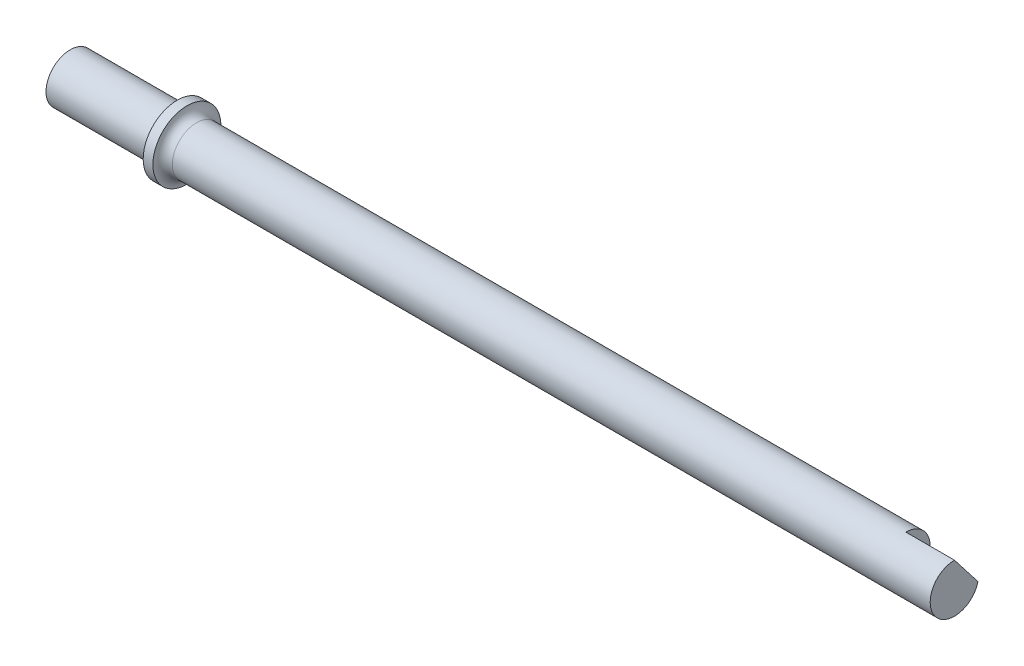
ISO-10303-21;
HEADER;
FILE_DESCRIPTION(('STEP AP214'),'2;1');
FILE_NAME('part.step','',(''),(''),'','','');
FILE_SCHEMA(('AUTOMOTIVE_DESIGN { 1 0 10303 214 1 1 1 1 }'));
ENDSEC;
DATA;
#1=APPLICATION_CONTEXT('core data for automotive mechanical design processes');
#2=APPLICATION_PROTOCOL_DEFINITION('international standard','automotive_design',2000,#1);
#3=PRODUCT_CONTEXT('',#1,'mechanical');
#4=PRODUCT('Part','Part','',(#3));
#5=PRODUCT_RELATED_PRODUCT_CATEGORY('part','',(#4));
#6=PRODUCT_DEFINITION_FORMATION('','',#4);
#7=PRODUCT_DEFINITION_CONTEXT('part definition',#1,'design');
#8=PRODUCT_DEFINITION('design','',#6,#7);
#9=PRODUCT_DEFINITION_SHAPE('','',#8);
#10=(LENGTH_UNIT() NAMED_UNIT(*) SI_UNIT(.MILLI.,.METRE.));
#11=(NAMED_UNIT(*) PLANE_ANGLE_UNIT() SI_UNIT($,.RADIAN.));
#12=(NAMED_UNIT(*) SI_UNIT($,.STERADIAN.) SOLID_ANGLE_UNIT());
#13=UNCERTAINTY_MEASURE_WITH_UNIT(LENGTH_MEASURE(1.E-05),#10,'distance_accuracy_value','');
#14=(GEOMETRIC_REPRESENTATION_CONTEXT(3) GLOBAL_UNCERTAINTY_ASSIGNED_CONTEXT((#13)) GLOBAL_UNIT_ASSIGNED_CONTEXT((#10,
#11,#12)) REPRESENTATION_CONTEXT('',''));
#15=CARTESIAN_POINT('',(0.,0.,0.));
#16=DIRECTION('',(0.,0.,1.));
#17=DIRECTION('',(1.,0.,0.));
#18=AXIS2_PLACEMENT_3D('',#15,#16,#17);
#19=CARTESIAN_POINT('',(-22.3967514323773,0.,0.));
#20=DIRECTION('',(-1.,0.,0.));
#21=DIRECTION('',(0.,0.,1.));
#22=AXIS2_PLACEMENT_3D('',#19,#20,#21);
#23=CYLINDRICAL_SURFACE('',#22,5.);
#24=CARTESIAN_POINT('',(26.,0.,0.));
#25=DIRECTION('',(-1.,0.,0.));
#26=DIRECTION('',(0.,0.,1.));
#27=AXIS2_PLACEMENT_3D('',#24,#25,#26);
#28=CIRCLE('',#27,5.);
#29=CARTESIAN_POINT('',(26.,0.,5.));
#30=VERTEX_POINT('',#29);
#31=EDGE_CURVE('E60',#30,#30,#28,.F.);
#32=ORIENTED_EDGE('',*,*,#31,.T.);
#33=EDGE_LOOP('',(#32));
#34=FACE_BOUND('',#33,.T.);
#35=CARTESIAN_POINT('',(182.,0.,0.));
#36=DIRECTION('',(-1.,0.,0.));
#37=DIRECTION('',(0.,0.,1.));
#38=AXIS2_PLACEMENT_3D('',#35,#36,#37);
#39=CIRCLE('',#38,5.);
#40=CARTESIAN_POINT('',(182.,-1.24224589981962,-4.84322466177044));
#41=VERTEX_POINT('',#40);
#42=CARTESIAN_POINT('',(182.,5.,0.));
#43=VERTEX_POINT('',#42);
#44=EDGE_CURVE('E91',#41,#43,#39,.T.);
#45=ORIENTED_EDGE('',*,*,#44,.T.);
#46=DIRECTION('',(-1.,0.,0.));
#47=VECTOR('',#46,1.);
#48=CARTESIAN_POINT('',(608.342194535885,5.,0.));
#49=LINE('',#48,#47);
#50=CARTESIAN_POINT('',(172.,5.,0.));
#51=VERTEX_POINT('',#50);
#52=EDGE_CURVE('E72',#43,#51,#49,.T.);
#53=ORIENTED_EDGE('',*,*,#52,.T.);
#54=CARTESIAN_POINT('',(172.,0.,0.));
#55=DIRECTION('',(-1.,0.,0.));
#56=DIRECTION('',(0.,0.,1.));
#57=AXIS2_PLACEMENT_3D('',#54,#55,#56);
#58=CIRCLE('',#57,5.);
#59=CARTESIAN_POINT('',(172.,-1.24224589981961,-4.84322466177044));
#60=VERTEX_POINT('',#59);
#61=EDGE_CURVE('E80',#51,#60,#58,.T.);
#62=ORIENTED_EDGE('',*,*,#61,.T.);
#63=DIRECTION('',(-1.,0.,0.));
#64=VECTOR('',#63,1.);
#65=CARTESIAN_POINT('',(608.342194535885,-1.24224589981962,-4.84322466177044));
#66=LINE('',#65,#64);
#67=EDGE_CURVE('E67',#41,#60,#66,.T.);
#68=ORIENTED_EDGE('',*,*,#67,.F.);
#69=EDGE_LOOP('',(#45,#53,#62,#68));
#70=FACE_BOUND('',#69,.T.);
#71=ADVANCED_FACE('F45',(#34,#70),#23,.T.);
#72=CARTESIAN_POINT('',(-22.3967514323773,0.,0.));
#73=DIRECTION('',(-1.,0.,0.));
#74=DIRECTION('',(0.,0.,1.));
#75=AXIS2_PLACEMENT_3D('',#72,#73,#74);
#76=CYLINDRICAL_SURFACE('',#75,7.);
#77=CARTESIAN_POINT('',(24.,0.,0.));
#78=DIRECTION('',(-1.,0.,0.));
#79=DIRECTION('',(0.,0.,1.));
#80=AXIS2_PLACEMENT_3D('',#77,#78,#79);
#81=CIRCLE('',#80,7.);
#82=CARTESIAN_POINT('',(24.,0.,7.));
#83=VERTEX_POINT('',#82);
#84=EDGE_CURVE('E116',#83,#83,#81,.T.);
#85=ORIENTED_EDGE('',*,*,#84,.T.);
#86=EDGE_LOOP('',(#85));
#87=FACE_BOUND('',#86,.T.);
#88=CARTESIAN_POINT('',(22.,0.,0.));
#89=DIRECTION('',(-1.,0.,0.));
#90=DIRECTION('',(0.,0.,1.));
#91=AXIS2_PLACEMENT_3D('',#88,#89,#90);
#92=CIRCLE('',#91,7.);
#93=CARTESIAN_POINT('',(22.,0.,7.));
#94=VERTEX_POINT('',#93);
#95=EDGE_CURVE('E112',#94,#94,#92,.T.);
#96=ORIENTED_EDGE('',*,*,#95,.F.);
#97=EDGE_LOOP('',(#96));
#98=FACE_BOUND('',#97,.T.);
#99=ADVANCED_FACE('F147',(#87,#98),#76,.T.);
#100=CARTESIAN_POINT('',(22.,0.,0.));
#101=DIRECTION('',(-1.,0.,0.));
#102=DIRECTION('',(0.,0.,1.));
#103=AXIS2_PLACEMENT_3D('',#100,#101,#102);
#104=PLANE('',#103);
#105=ORIENTED_EDGE('',*,*,#95,.T.);
#106=EDGE_LOOP('',(#105));
#107=FACE_BOUND('',#106,.T.);
#108=CARTESIAN_POINT('',(22.,0.,0.));
#109=DIRECTION('',(-1.,0.,0.));
#110=DIRECTION('',(0.,0.,1.));
#111=AXIS2_PLACEMENT_3D('',#108,#109,#110);
#112=CIRCLE('',#111,5.);
#113=CARTESIAN_POINT('',(22.,0.,5.));
#114=VERTEX_POINT('',#113);
#115=EDGE_CURVE('E108',#114,#114,#112,.T.);
#116=ORIENTED_EDGE('',*,*,#115,.F.);
#117=EDGE_LOOP('',(#116));
#118=FACE_BOUND('',#117,.T.);
#119=ADVANCED_FACE('F143',(#107,#118),#104,.T.);
#120=CARTESIAN_POINT('',(0.,0.,0.));
#121=DIRECTION('',(-1.,0.,0.));
#122=DIRECTION('',(0.,0.,1.));
#123=AXIS2_PLACEMENT_3D('',#120,#121,#122);
#124=PLANE('',#123);
#125=CARTESIAN_POINT('',(0.,0.,0.));
#126=DIRECTION('',(-1.,0.,0.));
#127=DIRECTION('',(0.,0.,1.));
#128=AXIS2_PLACEMENT_3D('',#125,#126,#127);
#129=CIRCLE('',#128,3.);
#130=CARTESIAN_POINT('',(0.,0.,3.));
#131=VERTEX_POINT('',#130);
#132=EDGE_CURVE('E97',#131,#131,#129,.T.);
#133=ORIENTED_EDGE('',*,*,#132,.F.);
#134=EDGE_LOOP('',(#133));
#135=FACE_BOUND('',#134,.T.);
#136=CARTESIAN_POINT('',(0.,0.,0.));
#137=DIRECTION('',(-1.,0.,0.));
#138=DIRECTION('',(0.,0.,1.));
#139=AXIS2_PLACEMENT_3D('',#136,#137,#138);
#140=CIRCLE('',#139,5.);
#141=CARTESIAN_POINT('',(0.,0.,5.));
#142=VERTEX_POINT('',#141);
#143=EDGE_CURVE('E122',#142,#142,#140,.T.);
#144=ORIENTED_EDGE('',*,*,#143,.T.);
#145=EDGE_LOOP('',(#144));
#146=FACE_BOUND('',#145,.T.);
#147=ADVANCED_FACE('F146',(#135,#146),#124,.T.);
#148=CARTESIAN_POINT('',(9.49999999999996,-5.00000000000005,0.));
#149=CARTESIAN_POINT('',(9.49999014817624,-4.99999271227095,0.107493005442889));
#150=CARTESIAN_POINT('',(9.49128224791159,-4.99649294306935,0.215172564090669));
#151=CARTESIAN_POINT('',(9.45675229647873,-4.98283453100639,0.427496480417891));
#152=CARTESIAN_POINT('',(9.43088372091383,-4.97265778698876,0.532131777561245));
#153=CARTESIAN_POINT('',(9.36312392194113,-4.94674209213119,0.734953922727403));
#154=CARTESIAN_POINT('',(9.32128515378323,-4.93102136364072,0.83316066161696));
#155=CARTESIAN_POINT('',(9.22298082667342,-4.89556610796078,1.02107197032837));
#156=CARTESIAN_POINT('',(9.16652034508104,-4.87583297458057,1.11077947675099));
#157=CARTESIAN_POINT('',(9.03776450143903,-4.83330886170419,1.28350100757039));
#158=CARTESIAN_POINT('',(8.96489334375971,-4.81042296929191,1.36606227255021));
#159=CARTESIAN_POINT('',(8.80659999652319,-4.76460576906195,1.51817500478472));
#160=CARTESIAN_POINT('',(8.72117170278823,-4.74167444453792,1.58772010713353));
#161=CARTESIAN_POINT('',(8.5355719297577,-4.69722791797136,1.71487456729288));
#162=CARTESIAN_POINT('',(8.43491351397677,-4.67582115964951,1.77181498119547));
#163=CARTESIAN_POINT('',(8.22446360157993,-4.63833647186793,1.86775471903715));
#164=CARTESIAN_POINT('',(8.11467647215161,-4.62225601244176,1.90676256428583));
#165=CARTESIAN_POINT('',(7.89428766640787,-4.59826357660818,1.96389882339587));
#166=CARTESIAN_POINT('',(7.78394876442376,-4.59001420355605,1.98289396580565));
#167=CARTESIAN_POINT('',(7.5613650016927,-4.58164004049144,2.00217296164003));
#168=CARTESIAN_POINT('',(7.44912110537496,-4.58151125522768,2.00246601631322));
#169=CARTESIAN_POINT('',(7.23424332854193,-4.58910500279994,1.98498936750454));
#170=CARTESIAN_POINT('',(7.13148428559094,-4.5962817503845,1.96847531430514));
#171=CARTESIAN_POINT('',(6.93034044399326,-4.61676187607836,1.91994688029782));
#172=CARTESIAN_POINT('',(6.83195641188966,-4.63006632321673,1.88792979480463));
#173=CARTESIAN_POINT('',(6.63998216380393,-4.6615948508853,1.80869473255107));
#174=CARTESIAN_POINT('',(6.54653076094528,-4.67991379280788,1.76117986231532));
#175=CARTESIAN_POINT('',(6.36858418363841,-4.7193811638989,1.65250646073222));
#176=CARTESIAN_POINT('',(6.28409239059716,-4.74053065456848,1.59134280510085));
#177=CARTESIAN_POINT('',(6.11959027119797,-4.78526736742271,1.45155059945444));
#178=CARTESIAN_POINT('',(6.04043127055395,-4.80891664976152,1.37193746297064));
#179=CARTESIAN_POINT('',(5.89631552199793,-4.85459824958282,1.2003144274302));
#180=CARTESIAN_POINT('',(5.83136160258967,-4.87663024445325,1.10830206533444));
#181=CARTESIAN_POINT('',(5.71638255258413,-4.91714681264548,0.912077652605846));
#182=CARTESIAN_POINT('',(5.66667771880291,-4.93555270095415,0.80766049134648));
#183=CARTESIAN_POINT('',(5.58583213892191,-4.96614828328759,0.591023765482884));
#184=CARTESIAN_POINT('',(5.55468196244256,-4.97834113462382,0.478808196849676));
#185=CARTESIAN_POINT('',(5.51355170458026,-4.99456139506911,0.256895887607822));
#186=CARTESIAN_POINT('',(5.50242754574641,-4.99902945833514,0.147443293985536));
#187=CARTESIAN_POINT('',(5.49828689947135,-5.00068478510631,-0.0718453098078154));
#188=CARTESIAN_POINT('',(5.50526571845245,-4.99787393582291,-0.181681213223922));
#189=CARTESIAN_POINT('',(5.53629175255196,-4.98557567063753,-0.393432739121985));
#190=CARTESIAN_POINT('',(5.55955798035094,-4.97639391345523,-0.495482491775472));
#191=CARTESIAN_POINT('',(5.62143570830978,-4.952594414055,-0.694135428060778));
#192=CARTESIAN_POINT('',(5.66004917966864,-4.93797597356531,-0.790737910224842));
#193=CARTESIAN_POINT('',(5.75278493967991,-4.90416594770812,-0.979078785816699));
#194=CARTESIAN_POINT('',(5.80734547204311,-4.88484815979804,-1.0705780227554));
#195=CARTESIAN_POINT('',(5.92994032390561,-4.84373364745525,-1.24344359124655));
#196=CARTESIAN_POINT('',(5.99798004292258,-4.82193593110271,-1.32480584076112));
#197=CARTESIAN_POINT('',(6.15087001294959,-4.77645117638112,-1.48072304302882));
#198=CARTESIAN_POINT('',(6.23653354150617,-4.75273441425052,-1.55447393380606));
#199=CARTESIAN_POINT('',(6.41944008300933,-4.70741672917132,-1.68675119741371));
#200=CARTESIAN_POINT('',(6.51668500033991,-4.68581615526511,-1.74527506133751));
#201=CARTESIAN_POINT('',(6.72146169459407,-4.64714299907709,-1.84580750193163));
#202=CARTESIAN_POINT('',(6.82908399921227,-4.63011630884788,-1.88765059453445));
#203=CARTESIAN_POINT('',(7.05073365171512,-4.60323673477931,-1.9522962197053));
#204=CARTESIAN_POINT('',(7.16475620581239,-4.59337855695998,-1.97511280526931));
#205=CARTESIAN_POINT('',(7.38712790177451,-4.58271759299926,-1.9997156172784));
#206=CARTESIAN_POINT('',(7.49529483959332,-4.58131421008171,-2.00289708230287));
#207=CARTESIAN_POINT('',(7.71054485771326,-4.58614836033098,-1.99180315927752));
#208=CARTESIAN_POINT('',(7.81762807390255,-4.59238492324793,-1.97752998791378));
#209=CARTESIAN_POINT('',(8.02333218985501,-4.61126649079021,-1.93307136615365));
#210=CARTESIAN_POINT('',(8.12212027443296,-4.62364831827449,-1.90353749357098));
#211=CARTESIAN_POINT('',(8.31337862961345,-4.65324001232697,-1.83000544849101));
#212=CARTESIAN_POINT('',(8.40584714689979,-4.67045121206007,-1.78600328139382));
#213=CARTESIAN_POINT('',(8.58760961927074,-4.70898609604491,-1.68187276275973));
#214=CARTESIAN_POINT('',(8.67641867013045,-4.73048882313242,-1.62096533515949));
#215=CARTESIAN_POINT('',(8.84299331720372,-4.77463804372237,-1.4858921192715));
#216=CARTESIAN_POINT('',(8.92075557212828,-4.79728488048406,-1.41172233481812));
#217=CARTESIAN_POINT('',(9.06820285326358,-4.84293567087394,-1.24650550627246));
#218=CARTESIAN_POINT('',(9.13703730689803,-4.86586757962185,-1.15467600114614));
#219=CARTESIAN_POINT('',(9.2583370426216,-4.90800406713717,-0.95990032028578));
#220=CARTESIAN_POINT('',(9.31079471215249,-4.92720691092906,-0.856949004547239));
#221=CARTESIAN_POINT('',(9.39662221519025,-4.95939714815862,-0.644738062495207));
#222=CARTESIAN_POINT('',(9.4303293235603,-4.97249363055029,-0.535631618219701));
#223=CARTESIAN_POINT('',(9.47863912095423,-4.99144306209364,-0.312876546281226));
#224=CARTESIAN_POINT('',(9.49330243674387,-4.99731899495631,-0.199243525858916));
#225=CARTESIAN_POINT('',(9.49939538097824,-4.99975899504138,-0.0569122978909316));
#226=CARTESIAN_POINT('',(9.50000260862916,-5.0000019296918,-0.0284626887407593));
#227=CARTESIAN_POINT('',(9.49999999999996,-5.00000000000005,0.));
#228=B_SPLINE_CURVE_WITH_KNOTS('',3,(#148,#149,#150,#151,#152,#153,#154,#155,#156,#157,#158,
#159,#160,#161,#162,#163,#164,#165,#166,#167,#168,#169,#170,#171,#172,#173,#174,#175,#176,#177,
#178,#179,#180,#181,#182,#183,#184,#185,#186,#187,#188,#189,#190,#191,#192,#193,#194,#195,#196,
#197,#198,#199,#200,#201,#202,#203,#204,#205,#206,#207,#208,#209,#210,#211,#212,#213,#214,#215,
#216,#217,#218,#219,#220,#221,#222,#223,#224,#225,#226,#227),.UNSPECIFIED.,.T.,.F.,(4,2,2,2,2,2,
2,2,2,2,2,2,2,2,2,2,2,2,2,2,2,2,2,2,2,2,2,2,2,2,2,2,2,2,2,2,2,2,2,4),(0.,0.322402987893066,
0.645683636007935,0.967911457471584,1.29002753567984,1.62597381700397,1.96208394934411,
2.31315258819217,2.66405423118268,2.99904105308828,3.33386306340488,3.64538328401372,
3.95695787256047,4.27489126298815,4.59294421938183,4.93558349186557,5.27829092839733,
5.62776913162806,5.9770695611379,6.30569184528007,6.63422893570082,6.94800455564365,
7.26182048993796,7.58523513398262,7.90877959498969,8.25368474624413,8.59864669043748,
8.94695045140828,9.29499672645934,9.61799673392748,9.94095572563046,10.2511431854877,
10.5614163580516,10.8894546805669,11.2175920134839,11.5670042353384,11.9165786364053,
12.2596430101332,12.6016125240434,12.686980458968),.UNSPECIFIED.);
#229=CARTESIAN_POINT('',(9.49999999999996,-5.00000000000005,0.));
#230=VERTEX_POINT('',#229);
#231=EDGE_CURVE('E12',#230,#230,#228,.T.);
#232=ORIENTED_EDGE('',*,*,#231,.F.);
#233=EDGE_LOOP('',(#232));
#234=FACE_BOUND('',#233,.T.);
#235=ORIENTED_EDGE('',*,*,#115,.T.);
#236=EDGE_LOOP('',(#235));
#237=FACE_BOUND('',#236,.T.);
#238=ORIENTED_EDGE('',*,*,#143,.F.);
#239=EDGE_LOOP('',(#238));
#240=FACE_BOUND('',#239,.T.);
#241=ADVANCED_FACE('F155',(#234,#237,#240),#23,.T.);
#242=CARTESIAN_POINT('',(182.,0.,0.));
#243=DIRECTION('',(1.,0.,0.));
#244=DIRECTION('',(0.,0.,-1.));
#245=AXIS2_PLACEMENT_3D('',#242,#243,#244);
#246=PLANE('',#245);
#247=DIRECTION('',(0.,-0.7900788504839,-0.613005228377408));
#248=VECTOR('',#247,1.);
#249=CARTESIAN_POINT('',(182.,5.,0.));
#250=LINE('',#249,#248);
#251=EDGE_CURVE('E93',#43,#41,#250,.T.);
#252=ORIENTED_EDGE('',*,*,#251,.F.);
#253=ORIENTED_EDGE('',*,*,#44,.F.);
#254=EDGE_LOOP('',(#252,#253));
#255=FACE_BOUND('',#254,.T.);
#256=ADVANCED_FACE('F162',(#255),#246,.T.);
#257=CARTESIAN_POINT('',(26.,0.,0.));
#258=DIRECTION('',(-1.,0.,0.));
#259=DIRECTION('',(0.,0.,1.));
#260=AXIS2_PLACEMENT_3D('',#257,#258,#259);
#261=TOROIDAL_SURFACE('',#260,7.,2.);
#262=ORIENTED_EDGE('',*,*,#31,.F.);
#263=EDGE_LOOP('',(#262));
#264=FACE_BOUND('',#263,.T.);
#265=ORIENTED_EDGE('',*,*,#84,.F.);
#266=EDGE_LOOP('',(#265));
#267=FACE_BOUND('',#266,.T.);
#268=ADVANCED_FACE('F47',(#264,#267),#261,.F.);
#269=CARTESIAN_POINT('',(7.5,0.,0.));
#270=DIRECTION('',(0.,-1.,0.));
#271=DIRECTION('',(1.,0.,0.));
#272=AXIS2_PLACEMENT_3D('',#269,#270,#271);
#273=CYLINDRICAL_SURFACE('',#272,2.);
#274=CARTESIAN_POINT('',(9.49999999999998,-3.,0.));
#275=CARTESIAN_POINT('',(9.50000054963245,-3.0000004164484,-0.100484716668078));
#276=CARTESIAN_POINT('',(9.49238603004448,-2.99490802753388,-0.200969087132902));
#277=CARTESIAN_POINT('',(9.46240313589432,-2.97504652423809,-0.398733058031681));
#278=CARTESIAN_POINT('',(9.44002775687668,-2.96027281581235,-0.496011113955008));
#279=CARTESIAN_POINT('',(9.38189228267514,-2.92250482404708,-0.68421230785425));
#280=CARTESIAN_POINT('',(9.34619485999204,-2.89954905493315,-0.775162872657556));
#281=CARTESIAN_POINT('',(9.26293663672848,-2.8472613787744,-0.949415290997262));
#282=CARTESIAN_POINT('',(9.21537411369942,-2.8179285460551,-1.03271603160967));
#283=CARTESIAN_POINT('',(9.10534306263255,-2.75227329369838,-1.19728470077011));
#284=CARTESIAN_POINT('',(9.04195213925708,-2.71556897579319,-1.27778030546068));
#285=CARTESIAN_POINT('',(8.90426995134153,-2.63982313083466,-1.42772804469274));
#286=CARTESIAN_POINT('',(8.82996307016224,-2.60077830356832,-1.49716405543888));
#287=CARTESIAN_POINT('',(8.6589476323873,-2.51728264678794,-1.63422297745496));
#288=CARTESIAN_POINT('',(8.56055434679652,-2.47295067937795,-1.6998318636275));
#289=CARTESIAN_POINT('',(8.35163662235345,-2.3908414735282,-1.81350357014175));
#290=CARTESIAN_POINT('',(8.24113359843724,-2.35305295954668,-1.86159673426503));
#291=CARTESIAN_POINT('',(8.04328870657835,-2.2997626664146,-1.92674035011438));
#292=CARTESIAN_POINT('',(7.95847154712607,-2.28097627892403,-1.94874447236008));
#293=CARTESIAN_POINT('',(7.78525549525833,-2.25257969659604,-1.98150617785229));
#294=CARTESIAN_POINT('',(7.69686305127392,-2.24295368744147,-1.99228314651963));
#295=CARTESIAN_POINT('',(7.51852522114351,-2.23436605608045,-2.00191364141227));
#296=CARTESIAN_POINT('',(7.42857497654758,-2.23544802558502,-2.00071842917524));
#297=CARTESIAN_POINT('',(7.25036502650023,-2.24819775483425,-1.98637581333356));
#298=CARTESIAN_POINT('',(7.16210681797185,-2.25987448286881,-1.97321828380393));
#299=CARTESIAN_POINT('',(6.9935329487581,-2.29127185989959,-1.93664994217326));
#300=CARTESIAN_POINT('',(6.91303866406121,-2.31061488324375,-1.91371711479477));
#301=CARTESIAN_POINT('',(6.7569763090242,-2.35509622933623,-1.85870118583424));
#302=CARTESIAN_POINT('',(6.68140986976133,-2.3802364585489,-1.8266150732855));
#303=CARTESIAN_POINT('',(6.52097460464354,-2.43964196377947,-1.74673818732648));
#304=CARTESIAN_POINT('',(6.43734009951689,-2.47472317740626,-1.69708052300445));
#305=CARTESIAN_POINT('',(6.27861660471423,-2.54691537733438,-1.58668960438221));
#306=CARTESIAN_POINT('',(6.20353834223791,-2.58402882709328,-1.52594268999614));
#307=CARTESIAN_POINT('',(6.04745745439656,-2.66543343763724,-1.37981165322308));
#308=CARTESIAN_POINT('',(5.96866595131722,-2.7095474472056,-1.29193938283656));
#309=CARTESIAN_POINT('',(5.82680350546149,-2.79218100665212,-1.10200799908008));
#310=CARTESIAN_POINT('',(5.763717854591,-2.83070577648042,-0.999962299343692));
#311=CARTESIAN_POINT('',(5.66652228137711,-2.89145404090364,-0.804857827096525));
#312=CARTESIAN_POINT('',(5.62915663666104,-2.9153926116554,-0.713957643371905));
#313=CARTESIAN_POINT('',(5.56789507437461,-2.95507719030499,-0.526036043935476));
#314=CARTESIAN_POINT('',(5.54398777286776,-2.97083012127544,-0.429019879001646));
#315=CARTESIAN_POINT('',(5.51083883476198,-2.99275882156808,-0.230985453172277));
#316=CARTESIAN_POINT('',(5.50166053906172,-2.99889322461187,-0.129951811934154));
#317=CARTESIAN_POINT('',(5.49875291143777,-3.00083114965147,0.0724415193893498));
#318=CARTESIAN_POINT('',(5.50502249951121,-2.99663539385634,0.173801186186628));
#319=CARTESIAN_POINT('',(5.53162405556193,-2.97899589424273,0.366455717204241));
#320=CARTESIAN_POINT('',(5.5509372977552,-2.96622246390226,0.457957444679195));
#321=CARTESIAN_POINT('',(5.60159568601284,-2.93318449284837,0.636116392427402));
#322=CARTESIAN_POINT('',(5.63294275092819,-2.91291875746989,0.722772837571134));
#323=CARTESIAN_POINT('',(5.7086522970449,-2.86496352529158,0.894664750465997));
#324=CARTESIAN_POINT('',(5.75368815408183,-2.83689870135785,0.97949618463142));
#325=CARTESIAN_POINT('',(5.85443328994625,-2.77601855611511,1.14068302395729));
#326=CARTESIAN_POINT('',(5.91014916053215,-2.74320030403941,1.21703314820091));
#327=CARTESIAN_POINT('',(6.04060786815749,-2.6695454665343,1.37185445482324));
#328=CARTESIAN_POINT('',(6.11696626007507,-2.62826156800165,1.44875187569565));
#329=CARTESIAN_POINT('',(6.2811114299571,-2.54571173085958,1.58933968069449));
#330=CARTESIAN_POINT('',(6.36890603910749,-2.50444582417845,1.6530209365723));
#331=CARTESIAN_POINT('',(6.5471424127681,-2.4293967897058,1.76124776549313));
#332=CARTESIAN_POINT('',(6.63673203346219,-2.39527597025701,1.80695636125283));
#333=CARTESIAN_POINT('',(6.82387265244361,-2.33438974266155,1.88496213740264));
#334=CARTESIAN_POINT('',(6.92140893830461,-2.30761112529822,1.91728345682189));
#335=CARTESIAN_POINT('',(7.1045644871954,-2.26933208182633,1.9623584346534));
#336=CARTESIAN_POINT('',(7.18917180987599,-2.25594998021257,1.97758597566225));
#337=CARTESIAN_POINT('',(7.36057328131837,-2.23879466438398,1.99699205923373));
#338=CARTESIAN_POINT('',(7.44736495113948,-2.23501101347816,2.00118260285317));
#339=CARTESIAN_POINT('',(7.62064305672368,-2.23764201149981,1.99823921981266));
#340=CARTESIAN_POINT('',(7.70712928137374,-2.24406269907463,1.99109858767784));
#341=CARTESIAN_POINT('',(7.8773435285321,-2.26610452403491,1.96596997224746));
#342=CARTESIAN_POINT('',(7.96106771382431,-2.28173793527615,1.94796751728258));
#343=CARTESIAN_POINT('',(8.14571118648122,-2.32526843904801,1.89593035657494));
#344=CARTESIAN_POINT('',(8.24526771294331,-2.35532333574983,1.85890187130765));
#345=CARTESIAN_POINT('',(8.43548683438419,-2.42222161121309,1.77084526236221));
#346=CARTESIAN_POINT('',(8.52613669799167,-2.459074496867,1.71979748341259));
#347=CARTESIAN_POINT('',(8.69928188713621,-2.53617186577119,1.60398280555153));
#348=CARTESIAN_POINT('',(8.78159874542303,-2.5764658739228,1.53898309894021));
#349=CARTESIAN_POINT('',(8.93532247825791,-2.65628301537844,1.39671768031094));
#350=CARTESIAN_POINT('',(9.00672599702919,-2.69580590832396,1.31944821025748));
#351=CARTESIAN_POINT('',(9.14671210430906,-2.77631551964082,1.14145732976974));
#352=CARTESIAN_POINT('',(9.2134186401783,-2.81669805449991,1.03896166955575));
#353=CARTESIAN_POINT('',(9.32791327666528,-2.88777665874161,0.820868555771218));
#354=CARTESIAN_POINT('',(9.37573110682393,-2.91848793445255,0.705292062449158));
#355=CARTESIAN_POINT('',(9.44115457816376,-2.96101644836895,0.491435069835746));
#356=CARTESIAN_POINT('',(9.4631110390986,-2.97551480368935,0.395012325257922));
#357=CARTESIAN_POINT('',(9.49252803253808,-2.99500280141853,0.199058012023946));
#358=CARTESIAN_POINT('',(9.49999945559599,-2.99999958751315,0.0995288361880077));
#359=CARTESIAN_POINT('',(9.49999999999998,-3.,0.));
#360=B_SPLINE_CURVE_WITH_KNOTS('',3,(#274,#275,#276,#277,#278,#279,#280,#281,#282,#283,#284,
#285,#286,#287,#288,#289,#290,#291,#292,#293,#294,#295,#296,#297,#298,#299,#300,#301,#302,#303,
#304,#305,#306,#307,#308,#309,#310,#311,#312,#313,#314,#315,#316,#317,#318,#319,#320,#321,#322,
#323,#324,#325,#326,#327,#328,#329,#330,#331,#332,#333,#334,#335,#336,#337,#338,#339,#340,#341,
#342,#343,#344,#345,#346,#347,#348,#349,#350,#351,#352,#353,#354,#355,#356,#357,#358,#359),
.UNSPECIFIED.,.T.,.F.,(4,2,2,2,2,2,2,2,2,2,2,2,2,2,2,2,2,2,2,2,2,2,2,2,2,2,2,2,2,2,2,2,2,2,2,2,
2,2,2,2,2,2,4),(0.,0.3010532265054,0.602249414348689,0.902046153190233,1.20188643867387,
1.52717029000557,1.85292411604319,2.23006683295983,2.60655305445439,2.87433693676029,
3.14165767845809,3.41006711735378,3.67870397263352,3.93548862198022,4.19235783805078,
4.50147574660874,4.81097703780057,5.18718954496753,5.56304840301363,5.86524087696759,
6.16717735142814,6.47040883294251,6.77361911533415,7.05553084792473,7.33748755138271,
7.63652346829516,7.93574454945204,8.28228176141292,8.62905753175758,8.94649935304476,
9.26336626640723,9.52324048016135,9.78283200333092,10.0425772028455,10.302669238524,
10.6320660870419,10.9619271337795,11.2977924520448,11.6337608397015,12.0179535155883,
12.4015390656083,12.6999529136674,12.9981423125957),.UNSPECIFIED.);
#361=CARTESIAN_POINT('',(9.49999999999998,-3.,0.));
#362=VERTEX_POINT('',#361);
#363=EDGE_CURVE('E49',#362,#362,#360,.T.);
#364=ORIENTED_EDGE('',*,*,#363,.T.);
#365=EDGE_LOOP('',(#364));
#366=FACE_BOUND('',#365,.T.);
#367=ORIENTED_EDGE('',*,*,#231,.T.);
#368=EDGE_LOOP('',(#367));
#369=FACE_BOUND('',#368,.T.);
#370=ADVANCED_FACE('F135',(#366,#369),#273,.F.);
#371=CARTESIAN_POINT('',(16.3,0.,0.));
#372=DIRECTION('',(-1.,0.,0.));
#373=DIRECTION('',(0.,0.,1.));
#374=AXIS2_PLACEMENT_3D('',#371,#372,#373);
#375=CYLINDRICAL_SURFACE('',#374,3.);
#376=ORIENTED_EDGE('',*,*,#132,.T.);
#377=EDGE_LOOP('',(#376));
#378=FACE_BOUND('',#377,.T.);
#379=CARTESIAN_POINT('',(16.3,0.,0.));
#380=DIRECTION('',(-1.,0.,0.));
#381=DIRECTION('',(0.,0.,1.));
#382=AXIS2_PLACEMENT_3D('',#379,#380,#381);
#383=CIRCLE('',#382,3.);
#384=CARTESIAN_POINT('',(16.3,0.,3.));
#385=VERTEX_POINT('',#384);
#386=EDGE_CURVE('E101',#385,#385,#383,.T.);
#387=ORIENTED_EDGE('',*,*,#386,.F.);
#388=EDGE_LOOP('',(#387));
#389=FACE_BOUND('',#388,.T.);
#390=ORIENTED_EDGE('',*,*,#363,.F.);
#391=EDGE_LOOP('',(#390));
#392=FACE_BOUND('',#391,.T.);
#393=ADVANCED_FACE('F139',(#378,#389,#392),#375,.F.);
#394=CARTESIAN_POINT('',(16.3,0.,0.));
#395=DIRECTION('',(-1.,0.,0.));
#396=DIRECTION('',(0.,0.,1.));
#397=AXIS2_PLACEMENT_3D('',#394,#395,#396);
#398=PLANE('',#397);
#399=ORIENTED_EDGE('',*,*,#386,.T.);
#400=EDGE_LOOP('',(#399));
#401=FACE_BOUND('',#400,.T.);
#402=ADVANCED_FACE('F192',(#401),#398,.T.);
#403=CARTESIAN_POINT('',(608.342194535885,5.,0.));
#404=DIRECTION('',(0.,0.613005228377408,-0.7900788504839));
#405=DIRECTION('',(0.,0.7900788504839,0.613005228377408));
#406=AXIS2_PLACEMENT_3D('',#403,#404,#405);
#407=PLANE('',#406);
#408=ORIENTED_EDGE('',*,*,#52,.F.);
#409=ORIENTED_EDGE('',*,*,#251,.T.);
#410=ORIENTED_EDGE('',*,*,#67,.T.);
#411=DIRECTION('',(0.,-0.7900788504839,-0.613005228377408));
#412=VECTOR('',#411,1.);
#413=CARTESIAN_POINT('',(172.,5.,0.));
#414=LINE('',#413,#412);
#415=EDGE_CURVE('E82',#51,#60,#414,.T.);
#416=ORIENTED_EDGE('',*,*,#415,.F.);
#417=EDGE_LOOP('',(#408,#409,#410,#416));
#418=FACE_BOUND('',#417,.T.);
#419=ADVANCED_FACE('F86',(#418),#407,.T.);
#420=CARTESIAN_POINT('',(172.,0.,0.));
#421=DIRECTION('',(1.,0.,0.));
#422=DIRECTION('',(0.,0.,-1.));
#423=AXIS2_PLACEMENT_3D('',#420,#421,#422);
#424=PLANE('',#423);
#425=ORIENTED_EDGE('',*,*,#415,.T.);
#426=ORIENTED_EDGE('',*,*,#61,.F.);
#427=EDGE_LOOP('',(#425,#426));
#428=FACE_BOUND('',#427,.T.);
#429=ADVANCED_FACE('F81',(#428),#424,.T.);
#430=CLOSED_SHELL('',(#71,#99,#119,#147,#241,#256,#268,#370,#393,#402,#419,#429));
#431=MANIFOLD_SOLID_BREP('B2',#430);
#432=ADVANCED_BREP_SHAPE_REPRESENTATION('',(#18,#431),#14);
#433=SHAPE_DEFINITION_REPRESENTATION(#9,#432);
ENDSEC;
END-ISO-10303-21;
